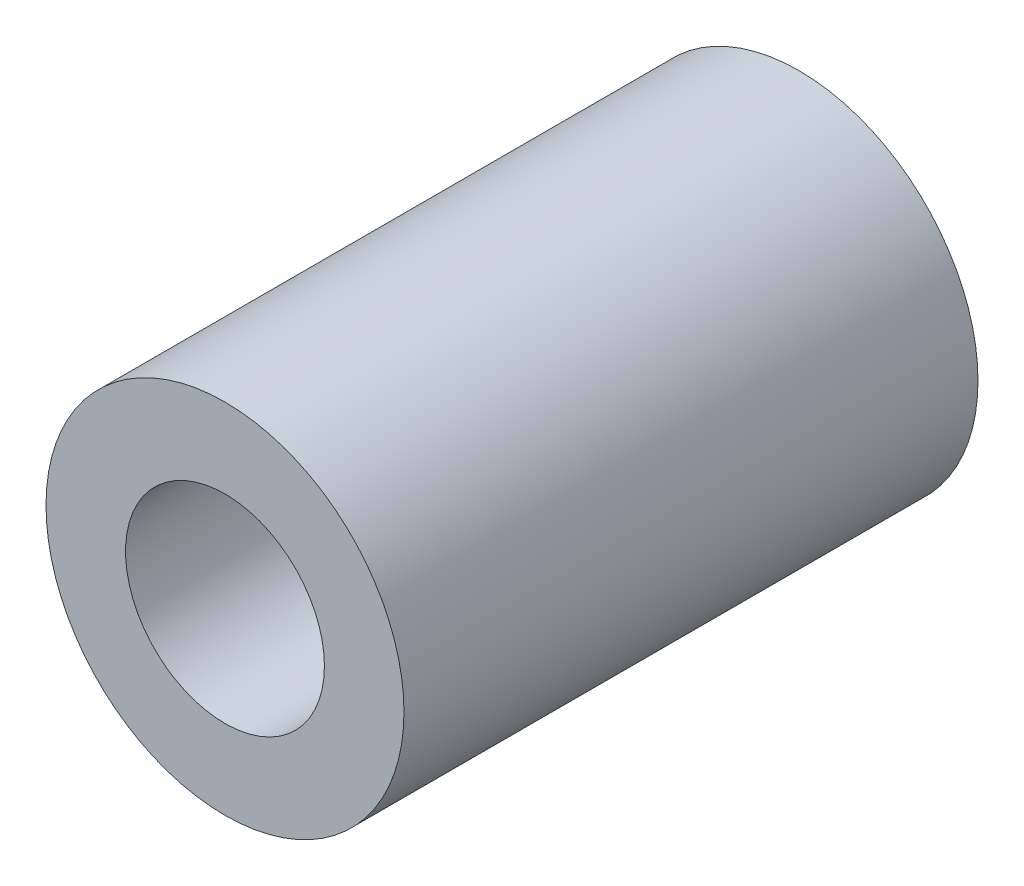
ISO-10303-21;
HEADER;
FILE_DESCRIPTION(('STEP AP214'),'2;1');
FILE_NAME('part.step','',(''),(''),'','','');
FILE_SCHEMA(('AUTOMOTIVE_DESIGN { 1 0 10303 214 1 1 1 1 }'));
ENDSEC;
DATA;
#1=APPLICATION_CONTEXT('core data for automotive mechanical design processes');
#2=APPLICATION_PROTOCOL_DEFINITION('international standard','automotive_design',2000,#1);
#3=PRODUCT_CONTEXT('',#1,'mechanical');
#4=PRODUCT('Part','Part','',(#3));
#5=PRODUCT_RELATED_PRODUCT_CATEGORY('part','',(#4));
#6=PRODUCT_DEFINITION_FORMATION('','',#4);
#7=PRODUCT_DEFINITION_CONTEXT('part definition',#1,'design');
#8=PRODUCT_DEFINITION('design','',#6,#7);
#9=PRODUCT_DEFINITION_SHAPE('','',#8);
#10=(LENGTH_UNIT() NAMED_UNIT(*) SI_UNIT(.MILLI.,.METRE.));
#11=(NAMED_UNIT(*) PLANE_ANGLE_UNIT() SI_UNIT($,.RADIAN.));
#12=(NAMED_UNIT(*) SI_UNIT($,.STERADIAN.) SOLID_ANGLE_UNIT());
#13=UNCERTAINTY_MEASURE_WITH_UNIT(LENGTH_MEASURE(1.E-05),#10,'distance_accuracy_value','');
#14=(GEOMETRIC_REPRESENTATION_CONTEXT(3) GLOBAL_UNCERTAINTY_ASSIGNED_CONTEXT((#13)) GLOBAL_UNIT_ASSIGNED_CONTEXT((#10,
#11,#12)) REPRESENTATION_CONTEXT('',''));
#15=CARTESIAN_POINT('',(0.,0.,0.));
#16=DIRECTION('',(0.,0.,1.));
#17=DIRECTION('',(1.,0.,0.));
#18=AXIS2_PLACEMENT_3D('',#15,#16,#17);
#19=CARTESIAN_POINT('',(0.,0.,-22.9108));
#20=DIRECTION('',(0.,0.,1.));
#21=DIRECTION('',(1.,0.,0.));
#22=AXIS2_PLACEMENT_3D('',#19,#20,#21);
#23=CYLINDRICAL_SURFACE('',#22,7.14375);
#24=CARTESIAN_POINT('',(0.,0.,-22.9108));
#25=DIRECTION('',(0.,0.,1.));
#26=DIRECTION('',(1.,0.,0.));
#27=AXIS2_PLACEMENT_3D('',#24,#25,#26);
#28=CIRCLE('',#27,7.14375);
#29=CARTESIAN_POINT('',(7.14375,0.,-22.9108));
#30=VERTEX_POINT('',#29);
#31=EDGE_CURVE('E10',#30,#30,#28,.T.);
#32=ORIENTED_EDGE('',*,*,#31,.T.);
#33=EDGE_LOOP('',(#32));
#34=FACE_BOUND('',#33,.T.);
#35=CARTESIAN_POINT('',(0.,0.,0.));
#36=DIRECTION('',(0.,0.,1.));
#37=DIRECTION('',(1.,0.,0.));
#38=AXIS2_PLACEMENT_3D('',#35,#36,#37);
#39=CIRCLE('',#38,7.14375);
#40=CARTESIAN_POINT('',(7.14375,0.,0.));
#41=VERTEX_POINT('',#40);
#42=EDGE_CURVE('E46',#41,#41,#39,.T.);
#43=ORIENTED_EDGE('',*,*,#42,.F.);
#44=EDGE_LOOP('',(#43));
#45=FACE_BOUND('',#44,.T.);
#46=ADVANCED_FACE('F43',(#34,#45),#23,.T.);
#47=CARTESIAN_POINT('',(0.,0.,-22.9108));
#48=DIRECTION('',(0.,0.,1.));
#49=DIRECTION('',(1.,0.,0.));
#50=AXIS2_PLACEMENT_3D('',#47,#48,#49);
#51=PLANE('',#50);
#52=CARTESIAN_POINT('',(0.,0.,-22.9108));
#53=DIRECTION('',(0.,0.,1.));
#54=DIRECTION('',(1.,0.,0.));
#55=AXIS2_PLACEMENT_3D('',#52,#53,#54);
#56=CIRCLE('',#55,3.96875);
#57=CARTESIAN_POINT('',(3.96875,0.,-22.9108));
#58=VERTEX_POINT('',#57);
#59=EDGE_CURVE('E55',#58,#58,#56,.T.);
#60=ORIENTED_EDGE('',*,*,#59,.T.);
#61=EDGE_LOOP('',(#60));
#62=FACE_BOUND('',#61,.T.);
#63=ORIENTED_EDGE('',*,*,#31,.F.);
#64=EDGE_LOOP('',(#63));
#65=FACE_BOUND('',#64,.T.);
#66=ADVANCED_FACE('F65',(#62,#65),#51,.F.);
#67=CARTESIAN_POINT('',(0.,0.,0.));
#68=DIRECTION('',(0.,0.,1.));
#69=DIRECTION('',(1.,0.,0.));
#70=AXIS2_PLACEMENT_3D('',#67,#68,#69);
#71=PLANE('',#70);
#72=CARTESIAN_POINT('',(0.,0.,0.));
#73=DIRECTION('',(0.,0.,1.));
#74=DIRECTION('',(1.,0.,0.));
#75=AXIS2_PLACEMENT_3D('',#72,#73,#74);
#76=CIRCLE('',#75,3.96875);
#77=CARTESIAN_POINT('',(3.96875,0.,0.));
#78=VERTEX_POINT('',#77);
#79=EDGE_CURVE('E57',#78,#78,#76,.T.);
#80=ORIENTED_EDGE('',*,*,#79,.F.);
#81=EDGE_LOOP('',(#80));
#82=FACE_BOUND('',#81,.T.);
#83=ORIENTED_EDGE('',*,*,#42,.T.);
#84=EDGE_LOOP('',(#83));
#85=FACE_BOUND('',#84,.T.);
#86=ADVANCED_FACE('F71',(#82,#85),#71,.T.);
#87=CARTESIAN_POINT('',(0.,0.,-22.9108));
#88=DIRECTION('',(0.,0.,1.));
#89=DIRECTION('',(1.,0.,0.));
#90=AXIS2_PLACEMENT_3D('',#87,#88,#89);
#91=CYLINDRICAL_SURFACE('',#90,3.96875);
#92=ORIENTED_EDGE('',*,*,#59,.F.);
#93=EDGE_LOOP('',(#92));
#94=FACE_BOUND('',#93,.T.);
#95=ORIENTED_EDGE('',*,*,#79,.T.);
#96=EDGE_LOOP('',(#95));
#97=FACE_BOUND('',#96,.T.);
#98=ADVANCED_FACE('F68',(#94,#97),#91,.F.);
#99=CLOSED_SHELL('',(#46,#66,#86,#98));
#100=MANIFOLD_SOLID_BREP('B2',#99);
#101=ADVANCED_BREP_SHAPE_REPRESENTATION('',(#18,#100),#14);
#102=SHAPE_DEFINITION_REPRESENTATION(#9,#101);
ENDSEC;
END-ISO-10303-21;
